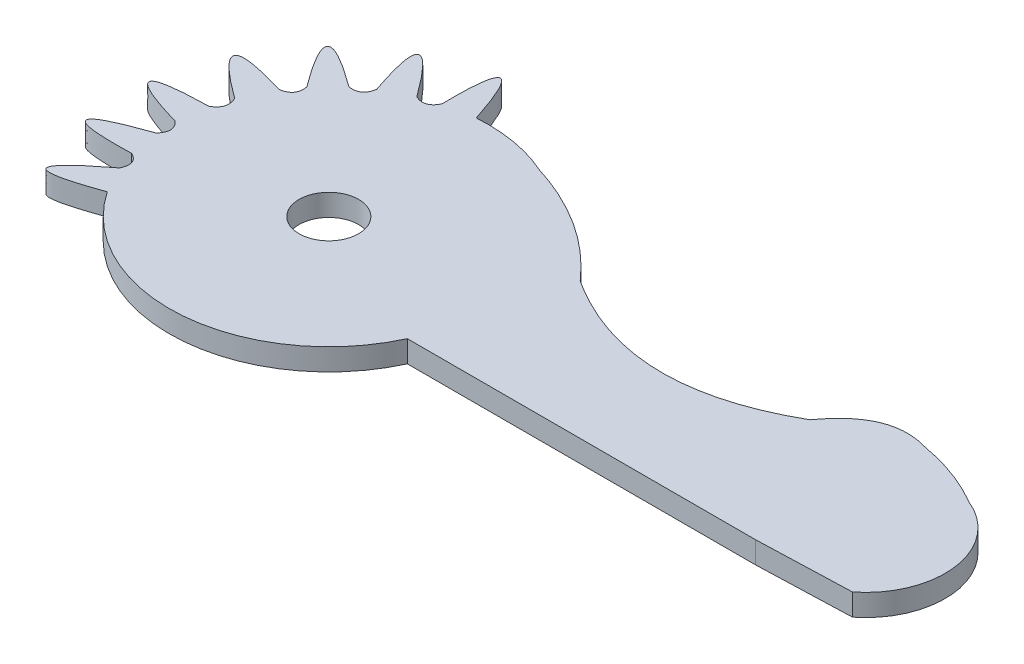
ISO-10303-21;
HEADER;
FILE_DESCRIPTION(('STEP AP214'),'2;1');
FILE_NAME('part.step','',(''),(''),'','','');
FILE_SCHEMA(('AUTOMOTIVE_DESIGN { 1 0 10303 214 1 1 1 1 }'));
ENDSEC;
DATA;
#1=APPLICATION_CONTEXT('core data for automotive mechanical design processes');
#2=APPLICATION_PROTOCOL_DEFINITION('international standard','automotive_design',2000,#1);
#3=PRODUCT_CONTEXT('',#1,'mechanical');
#4=PRODUCT('Part','Part','',(#3));
#5=PRODUCT_RELATED_PRODUCT_CATEGORY('part','',(#4));
#6=PRODUCT_DEFINITION_FORMATION('','',#4);
#7=PRODUCT_DEFINITION_CONTEXT('part definition',#1,'design');
#8=PRODUCT_DEFINITION('design','',#6,#7);
#9=PRODUCT_DEFINITION_SHAPE('','',#8);
#10=(LENGTH_UNIT() NAMED_UNIT(*) SI_UNIT(.MILLI.,.METRE.));
#11=(NAMED_UNIT(*) PLANE_ANGLE_UNIT() SI_UNIT($,.RADIAN.));
#12=(NAMED_UNIT(*) SI_UNIT($,.STERADIAN.) SOLID_ANGLE_UNIT());
#13=UNCERTAINTY_MEASURE_WITH_UNIT(LENGTH_MEASURE(1.E-05),#10,'distance_accuracy_value','');
#14=(GEOMETRIC_REPRESENTATION_CONTEXT(3) GLOBAL_UNCERTAINTY_ASSIGNED_CONTEXT((#13)) GLOBAL_UNIT_ASSIGNED_CONTEXT((#10,
#11,#12)) REPRESENTATION_CONTEXT('',''));
#15=CARTESIAN_POINT('',(0.,0.,0.));
#16=DIRECTION('',(0.,0.,1.));
#17=DIRECTION('',(1.,0.,0.));
#18=AXIS2_PLACEMENT_3D('',#15,#16,#17);
#19=CARTESIAN_POINT('',(0.,2.2,0.));
#20=DIRECTION('',(0.,1.,0.));
#21=DIRECTION('',(0.,0.,1.));
#22=AXIS2_PLACEMENT_3D('',#19,#20,#21);
#23=PLANE('',#22);
#24=CARTESIAN_POINT('',(0.,2.2,0.));
#25=DIRECTION('',(0.,1.,0.));
#26=DIRECTION('',(0.,0.,1.));
#27=AXIS2_PLACEMENT_3D('',#24,#25,#26);
#28=CIRCLE('',#27,16.0739677070553);
#29=CARTESIAN_POINT('',(-13.3181244117727,2.2,9.));
#30=VERTEX_POINT('',#29);
#31=CARTESIAN_POINT('',(14.6110382193551,2.2,6.7));
#32=VERTEX_POINT('',#31);
#33=EDGE_CURVE('E397',#30,#32,#28,.T.);
#34=ORIENTED_EDGE('',*,*,#33,.T.);
#35=DIRECTION('',(1.,0.,0.));
#36=VECTOR('',#35,1.);
#37=CARTESIAN_POINT('',(14.6110382193551,2.2,6.7));
#38=LINE('',#37,#36);
#39=CARTESIAN_POINT('',(49.6904432139309,2.2,6.7));
#40=VERTEX_POINT('',#39);
#41=EDGE_CURVE('E139',#32,#40,#38,.T.);
#42=ORIENTED_EDGE('',*,*,#41,.T.);
#43=DIRECTION('',(0.999414604685837,0.,-0.0342118099587287));
#44=VECTOR('',#43,1.);
#45=CARTESIAN_POINT('',(49.6904432139309,2.2,6.7));
#46=LINE('',#45,#44);
#47=CARTESIAN_POINT('',(59.1421347100975,2.2,6.37645112274797));
#48=VERTEX_POINT('',#47);
#49=EDGE_CURVE('E394',#40,#48,#46,.T.);
#50=ORIENTED_EDGE('',*,*,#49,.T.);
#51=CARTESIAN_POINT('',(54.1955227979198,2.2,0.08908040119025));
#52=DIRECTION('',(0.,1.,0.));
#53=DIRECTION('',(0.,0.,1.));
#54=AXIS2_PLACEMENT_3D('',#51,#52,#53);
#55=CIRCLE('',#54,8.);
#56=CARTESIAN_POINT('',(57.1955227979198,2.2,-7.32711808590541));
#57=VERTEX_POINT('',#56);
#58=EDGE_CURVE('E389',#48,#57,#55,.T.);
#59=ORIENTED_EDGE('',*,*,#58,.T.);
#60=CARTESIAN_POINT('',(57.1955227979198,2.2,-7.32711808590541));
#61=CARTESIAN_POINT('',(55.0441661515011,2.2,-8.59284596352752));
#62=CARTESIAN_POINT('',(52.7613610635912,2.2,-9.44385982918825));
#63=CARTESIAN_POINT('',(50.3471075342058,2.2,-9.88015968288478));
#64=B_SPLINE_CURVE_WITH_KNOTS('',3,(#60,#61,#62,#63),.UNSPECIFIED.,.F.,.F.,(4,4),
(0.288436631386398,1.),.UNSPECIFIED.);
#65=CARTESIAN_POINT('',(50.3471075342058,2.2,-9.88015968288478));
#66=VERTEX_POINT('',#65);
#67=EDGE_CURVE('E381',#57,#66,#64,.T.);
#68=ORIENTED_EDGE('',*,*,#67,.T.);
#69=CARTESIAN_POINT('',(50.3471075342058,2.2,-9.88015968288478));
#70=CARTESIAN_POINT('',(49.3037046635884,2.2,-10.1960733015901));
#71=CARTESIAN_POINT('',(46.3170816729696,2.2,-10.5567937203678));
#72=CARTESIAN_POINT('',(43.6670457923112,2.2,-8.84896027063307));
#73=CARTESIAN_POINT('',(41.9843605931134,2.2,-6.51415198749853));
#74=B_SPLINE_CURVE_WITH_KNOTS('',3,(#69,#70,#71,#72,#73),.UNSPECIFIED.,.F.,.F.,(4,1,4),
(0.0900850462791173,0.305835094832972,0.736118781976558),.UNSPECIFIED.);
#75=CARTESIAN_POINT('',(41.9843605931134,2.2,-6.51415198749853));
#76=VERTEX_POINT('',#75);
#77=EDGE_CURVE('E377',#66,#76,#74,.T.);
#78=ORIENTED_EDGE('',*,*,#77,.T.);
#79=CARTESIAN_POINT('',(41.9843605931134,2.2,-6.51415198749853));
#80=CARTESIAN_POINT('',(29.823970963395,2.2,0.449921725729593));
#81=CARTESIAN_POINT('',(18.2939540597451,2.2,-7.03712532677834));
#82=B_SPLINE_CURVE_WITH_KNOTS('',2,(#79,#80,#81),.UNSPECIFIED.,.F.,.F.,(3,3),(0.,1.),.UNSPECIFIED.);
#83=CARTESIAN_POINT('',(18.2939540597451,2.2,-7.03712532677834));
#84=VERTEX_POINT('',#83);
#85=EDGE_CURVE('E352',#76,#84,#82,.T.);
#86=ORIENTED_EDGE('',*,*,#85,.T.);
#87=CARTESIAN_POINT('',(18.2939540597451,2.2,-7.03712532677834));
#88=CARTESIAN_POINT('',(13.5089534166022,2.2,-12.4928165220149));
#89=CARTESIAN_POINT('',(6.55512816257974,2.2,-14.6766049418662));
#90=B_SPLINE_CURVE_WITH_KNOTS('',2,(#87,#88,#89),.UNSPECIFIED.,.F.,.F.,(3,3),(0.,1.),.UNSPECIFIED.);
#91=CARTESIAN_POINT('',(6.55512816257974,2.2,-14.6766049418662));
#92=VERTEX_POINT('',#91);
#93=EDGE_CURVE('E347',#84,#92,#90,.T.);
#94=ORIENTED_EDGE('',*,*,#93,.T.);
#95=CARTESIAN_POINT('',(0.,2.2,0.));
#96=DIRECTION('',(0.,1.,0.));
#97=DIRECTION('',(0.,0.,1.));
#98=AXIS2_PLACEMENT_3D('',#95,#96,#97);
#99=CIRCLE('',#98,16.0739677070553);
#100=CARTESIAN_POINT('',(-1.17402328634825,2.2,-16.0310357485275));
#101=VERTEX_POINT('',#100);
#102=EDGE_CURVE('E342',#92,#101,#99,.T.);
#103=ORIENTED_EDGE('',*,*,#102,.T.);
#104=CARTESIAN_POINT('',(-1.17402328634825,2.2,-16.0310357485275));
#105=CARTESIAN_POINT('',(-4.31115929351365,2.2,-25.6439633812806));
#106=CARTESIAN_POINT('',(-4.13250681705568,2.2,-15.533667475984));
#107=B_SPLINE_CURVE_WITH_KNOTS('',2,(#104,#105,#106),.UNSPECIFIED.,.F.,.F.,(3,3),(0.,1.),.UNSPECIFIED.);
#108=CARTESIAN_POINT('',(-4.13250681705568,2.2,-15.533667475984));
#109=VERTEX_POINT('',#108);
#110=EDGE_CURVE('E334',#101,#109,#107,.T.);
#111=ORIENTED_EDGE('',*,*,#110,.T.);
#112=CARTESIAN_POINT('',(-4.13250681705568,2.2,-15.533667475984));
#113=CARTESIAN_POINT('',(-4.764310753869,2.2,-14.2684308240382));
#114=CARTESIAN_POINT('',(-6.02954740581487,2.2,-14.9002347608515));
#115=B_SPLINE_CURVE_WITH_KNOTS('',2,(#112,#113,#114),.UNSPECIFIED.,.F.,.F.,(3,3),(0.,1.),.UNSPECIFIED.);
#116=CARTESIAN_POINT('',(-6.02954740581487,2.2,-14.9002347608515));
#117=VERTEX_POINT('',#116);
#118=EDGE_CURVE('E330',#109,#117,#115,.T.);
#119=ORIENTED_EDGE('',*,*,#118,.T.);
#120=CARTESIAN_POINT('',(-6.02954740581487,2.2,-14.9002347608515));
#121=CARTESIAN_POINT('',(-11.9612421792253,2.2,-23.0895569009981));
#122=CARTESIAN_POINT('',(-8.69333508977325,2.2,-13.5202944814221));
#123=B_SPLINE_CURVE_WITH_KNOTS('',2,(#120,#121,#122),.UNSPECIFIED.,.F.,.F.,(3,3),(0.,1.),.UNSPECIFIED.);
#124=CARTESIAN_POINT('',(-8.69333508977325,2.2,-13.5202944814221));
#125=VERTEX_POINT('',#124);
#126=EDGE_CURVE('E307',#117,#125,#123,.T.);
#127=ORIENTED_EDGE('',*,*,#126,.T.);
#128=CARTESIAN_POINT('',(-8.69333508977325,2.2,-13.5202944814221));
#129=CARTESIAN_POINT('',(-8.90707486155734,2.2,-12.1223262021119));
#130=CARTESIAN_POINT('',(-10.3050431408676,2.2,-12.336065973896));
#131=B_SPLINE_CURVE_WITH_KNOTS('',2,(#128,#129,#130),.UNSPECIFIED.,.F.,.F.,(3,3),(0.,1.),.UNSPECIFIED.);
#132=CARTESIAN_POINT('',(-10.3050431408676,2.2,-12.336065973896));
#133=VERTEX_POINT('',#132);
#134=EDGE_CURVE('E299',#125,#133,#131,.T.);
#135=ORIENTED_EDGE('',*,*,#134,.T.);
#136=CARTESIAN_POINT('',(-10.3050431408676,2.2,-12.336065973896));
#137=CARTESIAN_POINT('',(-18.4606814909088,2.2,-18.3139889495905));
#138=CARTESIAN_POINT('',(-12.4178848215133,2.2,-10.2063007209804));
#139=B_SPLINE_CURVE_WITH_KNOTS('',2,(#136,#137,#138),.UNSPECIFIED.,.F.,.F.,(3,3),(0.,1.),.UNSPECIFIED.);
#140=CARTESIAN_POINT('',(-12.4178848215133,2.2,-10.2063007209804));
#141=VERTEX_POINT('',#140);
#142=EDGE_CURVE('E291',#133,#141,#139,.T.);
#143=ORIENTED_EDGE('',*,*,#142,.T.);
#144=CARTESIAN_POINT('',(-12.4178848215133,2.2,-10.2063007209804));
#145=CARTESIAN_POINT('',(-12.1929991611997,2.2,-8.81008209920758));
#146=CARTESIAN_POINT('',(-13.5892177829726,2.2,-8.58519643889399));
#147=B_SPLINE_CURVE_WITH_KNOTS('',2,(#144,#145,#146),.UNSPECIFIED.,.F.,.F.,(3,3),(0.,1.),.UNSPECIFIED.);
#148=CARTESIAN_POINT('',(-13.5892177829726,2.2,-8.58519643889399));
#149=VERTEX_POINT('',#148);
#150=EDGE_CURVE('E287',#141,#149,#147,.T.);
#151=ORIENTED_EDGE('',*,*,#150,.T.);
#152=CARTESIAN_POINT('',(-13.5892177829726,2.2,-8.58519643889399));
#153=CARTESIAN_POINT('',(-23.2950739914482,2.2,-11.5171465993588));
#154=CARTESIAN_POINT('',(-15.0724257698096,2.2,-5.58519643889399));
#155=B_SPLINE_CURVE_WITH_KNOTS('',2,(#152,#153,#154),.UNSPECIFIED.,.F.,.F.,(3,3),(0.,1.),.UNSPECIFIED.);
#156=CARTESIAN_POINT('',(-15.0724257698096,2.2,-5.58519643889399));
#157=VERTEX_POINT('',#156);
#158=EDGE_CURVE('E264',#149,#157,#155,.T.);
#159=ORIENTED_EDGE('',*,*,#158,.T.);
#160=CARTESIAN_POINT('',(-15.0724257698096,2.2,-5.58519643889399));
#161=CARTESIAN_POINT('',(-14.4124610618603,2.2,-4.2993373399729));
#162=CARTESIAN_POINT('',(-15.6690396751683,2.2,-3.58519643889399));
#163=B_SPLINE_CURVE_WITH_KNOTS('',2,(#160,#161,#162),.UNSPECIFIED.,.F.,.F.,(3,3),(0.,1.),.UNSPECIFIED.);
#164=CARTESIAN_POINT('',(-15.6690396751683,2.2,-3.58519643889399));
#165=VERTEX_POINT('',#164);
#166=EDGE_CURVE('E256',#157,#165,#163,.T.);
#167=ORIENTED_EDGE('',*,*,#166,.T.);
#168=CARTESIAN_POINT('',(-15.6690396751683,2.2,-3.58519643889399));
#169=CARTESIAN_POINT('',(-25.7809172176548,2.2,-3.38823153237769));
#170=CARTESIAN_POINT('',(-16.06331170635,2.2,-0.585196438893989));
#171=B_SPLINE_CURVE_WITH_KNOTS('',2,(#168,#169,#170),.UNSPECIFIED.,.F.,.F.,(3,3),(0.,1.),.UNSPECIFIED.);
#172=CARTESIAN_POINT('',(-16.06331170635,2.2,-0.585196438893989));
#173=VERTEX_POINT('',#172);
#174=EDGE_CURVE('E248',#165,#173,#171,.T.);
#175=ORIENTED_EDGE('',*,*,#174,.T.);
#176=CARTESIAN_POINT('',(-16.06331170635,2.2,-0.585196438893989));
#177=CARTESIAN_POINT('',(-15.0378750753459,2.2,0.394118454941576));
#178=CARTESIAN_POINT('',(-16.0115823306423,2.2,1.41480356110601));
#179=B_SPLINE_CURVE_WITH_KNOTS('',2,(#176,#177,#178),.UNSPECIFIED.,.F.,.F.,(3,3),(0.,1.),.UNSPECIFIED.);
#180=CARTESIAN_POINT('',(-16.0115823306423,2.2,1.41480356110601));
#181=VERTEX_POINT('',#180);
#182=EDGE_CURVE('E200',#173,#181,#179,.T.);
#183=ORIENTED_EDGE('',*,*,#182,.T.);
#184=CARTESIAN_POINT('',(-16.0115823306423,2.2,1.41480356110601));
#185=CARTESIAN_POINT('',(-25.566384922753,2.2,4.7363949242953));
#186=CARTESIAN_POINT('',(-15.4558062670409,2.2,4.41480356110602));
#187=B_SPLINE_CURVE_WITH_KNOTS('',2,(#184,#185,#186),.UNSPECIFIED.,.F.,.F.,(3,3),(0.,1.),.UNSPECIFIED.);
#188=CARTESIAN_POINT('',(-15.4558062670409,2.2,4.41480356110602));
#189=VERTEX_POINT('',#188);
#190=EDGE_CURVE('E194',#181,#189,#187,.T.);
#191=ORIENTED_EDGE('',*,*,#190,.T.);
#192=CARTESIAN_POINT('',(-15.4558062670409,2.2,4.41480356110602));
#193=CARTESIAN_POINT('',(-14.1792697764444,2.2,5.02345336861065));
#194=CARTESIAN_POINT('',(-14.787919583949,2.2,6.2999898592072));
#195=B_SPLINE_CURVE_WITH_KNOTS('',2,(#192,#193,#194),.UNSPECIFIED.,.F.,.F.,(3,3),(0.,1.),.UNSPECIFIED.);
#196=CARTESIAN_POINT('',(-14.787919583949,2.2,6.2999898592072));
#197=VERTEX_POINT('',#196);
#198=EDGE_CURVE('E198',#189,#197,#195,.T.);
#199=ORIENTED_EDGE('',*,*,#198,.T.);
#200=CARTESIAN_POINT('',(-14.787919583949,2.2,6.2999898592072));
#201=CARTESIAN_POINT('',(-22.8359917841327,2.2,12.4311497831339));
#202=CARTESIAN_POINT('',(-13.3181244117727,2.2,9.));
#203=B_SPLINE_CURVE_WITH_KNOTS('',2,(#200,#201,#202),.UNSPECIFIED.,.F.,.F.,(3,3),(0.,1.),.UNSPECIFIED.);
#204=EDGE_CURVE('E54',#197,#30,#203,.T.);
#205=ORIENTED_EDGE('',*,*,#204,.T.);
#206=EDGE_LOOP('',(#34,#42,#50,#59,#68,#78,#86,#94,#103,#111,#119,#127,#135,#143,#151,#159,#167,
#175,#183,#191,#199,#205));
#207=FACE_BOUND('',#206,.T.);
#208=CARTESIAN_POINT('',(0.,2.2,0.));
#209=DIRECTION('',(0.,1.,0.));
#210=DIRECTION('',(0.,0.,1.));
#211=AXIS2_PLACEMENT_3D('',#208,#209,#210);
#212=CIRCLE('',#211,3.);
#213=CARTESIAN_POINT('',(0.,2.2,3.));
#214=VERTEX_POINT('',#213);
#215=EDGE_CURVE('E402',#214,#214,#212,.T.);
#216=ORIENTED_EDGE('',*,*,#215,.F.);
#217=EDGE_LOOP('',(#216));
#218=FACE_BOUND('',#217,.T.);
#219=ADVANCED_FACE('F37',(#207,#218),#23,.T.);
#220=CARTESIAN_POINT('',(0.,0.,0.));
#221=DIRECTION('',(0.,1.,0.));
#222=DIRECTION('',(0.,0.,1.));
#223=AXIS2_PLACEMENT_3D('',#220,#221,#222);
#224=PLANE('',#223);
#225=CARTESIAN_POINT('',(0.,0.,0.));
#226=DIRECTION('',(0.,1.,0.));
#227=DIRECTION('',(0.,0.,1.));
#228=AXIS2_PLACEMENT_3D('',#225,#226,#227);
#229=CIRCLE('',#228,16.0739677070553);
#230=CARTESIAN_POINT('',(-13.3181244117727,0.,9.));
#231=VERTEX_POINT('',#230);
#232=CARTESIAN_POINT('',(14.6110382193551,0.,6.7));
#233=VERTEX_POINT('',#232);
#234=EDGE_CURVE('E404',#231,#233,#229,.T.);
#235=ORIENTED_EDGE('',*,*,#234,.F.);
#236=CARTESIAN_POINT('',(-14.787919583949,0.,6.2999898592072));
#237=CARTESIAN_POINT('',(-22.8359917841327,0.,12.4311497831339));
#238=CARTESIAN_POINT('',(-13.3181244117727,0.,9.));
#239=B_SPLINE_CURVE_WITH_KNOTS('',2,(#236,#237,#238),.UNSPECIFIED.,.F.,.F.,(3,3),(0.,1.),.UNSPECIFIED.);
#240=CARTESIAN_POINT('',(-14.787919583949,0.,6.2999898592072));
#241=VERTEX_POINT('',#240);
#242=EDGE_CURVE('E131',#241,#231,#239,.T.);
#243=ORIENTED_EDGE('',*,*,#242,.F.);
#244=CARTESIAN_POINT('',(-15.4558062670409,0.,4.41480356110602));
#245=CARTESIAN_POINT('',(-14.1792697764444,0.,5.02345336861065));
#246=CARTESIAN_POINT('',(-14.787919583949,0.,6.2999898592072));
#247=B_SPLINE_CURVE_WITH_KNOTS('',2,(#244,#245,#246),.UNSPECIFIED.,.F.,.F.,(3,3),(0.,1.),.UNSPECIFIED.);
#248=CARTESIAN_POINT('',(-15.4558062670409,0.,4.41480356110602));
#249=VERTEX_POINT('',#248);
#250=EDGE_CURVE('E125',#249,#241,#247,.T.);
#251=ORIENTED_EDGE('',*,*,#250,.F.);
#252=CARTESIAN_POINT('',(-16.0115823306423,0.,1.41480356110601));
#253=CARTESIAN_POINT('',(-25.566384922753,0.,4.7363949242953));
#254=CARTESIAN_POINT('',(-15.4558062670409,0.,4.41480356110602));
#255=B_SPLINE_CURVE_WITH_KNOTS('',2,(#252,#253,#254),.UNSPECIFIED.,.F.,.F.,(3,3),(0.,1.),.UNSPECIFIED.);
#256=CARTESIAN_POINT('',(-16.0115823306423,0.,1.41480356110601));
#257=VERTEX_POINT('',#256);
#258=EDGE_CURVE('E208',#257,#249,#255,.T.);
#259=ORIENTED_EDGE('',*,*,#258,.F.);
#260=CARTESIAN_POINT('',(-16.06331170635,0.,-0.585196438893989));
#261=CARTESIAN_POINT('',(-15.0378750753459,0.,0.394118454941576));
#262=CARTESIAN_POINT('',(-16.0115823306423,0.,1.41480356110601));
#263=B_SPLINE_CURVE_WITH_KNOTS('',2,(#260,#261,#262),.UNSPECIFIED.,.F.,.F.,(3,3),(0.,1.),.UNSPECIFIED.);
#264=CARTESIAN_POINT('',(-16.06331170635,0.,-0.585196438893989));
#265=VERTEX_POINT('',#264);
#266=EDGE_CURVE('E508',#265,#257,#263,.T.);
#267=ORIENTED_EDGE('',*,*,#266,.F.);
#268=CARTESIAN_POINT('',(-15.6690396751683,0.,-3.58519643889399));
#269=CARTESIAN_POINT('',(-25.7809172176548,0.,-3.38823153237769));
#270=CARTESIAN_POINT('',(-16.06331170635,0.,-0.585196438893989));
#271=B_SPLINE_CURVE_WITH_KNOTS('',2,(#268,#269,#270),.UNSPECIFIED.,.F.,.F.,(3,3),(0.,1.),.UNSPECIFIED.);
#272=CARTESIAN_POINT('',(-15.6690396751683,0.,-3.58519643889399));
#273=VERTEX_POINT('',#272);
#274=EDGE_CURVE('E501',#273,#265,#271,.T.);
#275=ORIENTED_EDGE('',*,*,#274,.F.);
#276=CARTESIAN_POINT('',(-15.0724257698096,0.,-5.58519643889399));
#277=CARTESIAN_POINT('',(-14.4124610618603,0.,-4.2993373399729));
#278=CARTESIAN_POINT('',(-15.6690396751683,0.,-3.58519643889399));
#279=B_SPLINE_CURVE_WITH_KNOTS('',2,(#276,#277,#278),.UNSPECIFIED.,.F.,.F.,(3,3),(0.,1.),.UNSPECIFIED.);
#280=CARTESIAN_POINT('',(-15.0724257698096,0.,-5.58519643889399));
#281=VERTEX_POINT('',#280);
#282=EDGE_CURVE('E494',#281,#273,#279,.T.);
#283=ORIENTED_EDGE('',*,*,#282,.F.);
#284=CARTESIAN_POINT('',(-13.5892177829726,0.,-8.58519643889399));
#285=CARTESIAN_POINT('',(-23.2950739914482,0.,-11.5171465993588));
#286=CARTESIAN_POINT('',(-15.0724257698096,0.,-5.58519643889399));
#287=B_SPLINE_CURVE_WITH_KNOTS('',2,(#284,#285,#286),.UNSPECIFIED.,.F.,.F.,(3,3),(0.,1.),.UNSPECIFIED.);
#288=CARTESIAN_POINT('',(-13.5892177829726,0.,-8.58519643889399));
#289=VERTEX_POINT('',#288);
#290=EDGE_CURVE('E487',#289,#281,#287,.T.);
#291=ORIENTED_EDGE('',*,*,#290,.F.);
#292=CARTESIAN_POINT('',(-12.4178848215133,0.,-10.2063007209804));
#293=CARTESIAN_POINT('',(-12.1929991611997,0.,-8.81008209920758));
#294=CARTESIAN_POINT('',(-13.5892177829726,0.,-8.58519643889399));
#295=B_SPLINE_CURVE_WITH_KNOTS('',2,(#292,#293,#294),.UNSPECIFIED.,.F.,.F.,(3,3),(0.,1.),.UNSPECIFIED.);
#296=CARTESIAN_POINT('',(-12.4178848215133,0.,-10.2063007209804));
#297=VERTEX_POINT('',#296);
#298=EDGE_CURVE('E480',#297,#289,#295,.T.);
#299=ORIENTED_EDGE('',*,*,#298,.F.);
#300=CARTESIAN_POINT('',(-10.3050431408676,0.,-12.336065973896));
#301=CARTESIAN_POINT('',(-18.4606814909088,0.,-18.3139889495905));
#302=CARTESIAN_POINT('',(-12.4178848215133,0.,-10.2063007209804));
#303=B_SPLINE_CURVE_WITH_KNOTS('',2,(#300,#301,#302),.UNSPECIFIED.,.F.,.F.,(3,3),(0.,1.),.UNSPECIFIED.);
#304=CARTESIAN_POINT('',(-10.3050431408676,0.,-12.336065973896));
#305=VERTEX_POINT('',#304);
#306=EDGE_CURVE('E473',#305,#297,#303,.T.);
#307=ORIENTED_EDGE('',*,*,#306,.F.);
#308=CARTESIAN_POINT('',(-8.69333508977325,0.,-13.5202944814221));
#309=CARTESIAN_POINT('',(-8.90707486155734,0.,-12.1223262021119));
#310=CARTESIAN_POINT('',(-10.3050431408676,0.,-12.336065973896));
#311=B_SPLINE_CURVE_WITH_KNOTS('',2,(#308,#309,#310),.UNSPECIFIED.,.F.,.F.,(3,3),(0.,1.),.UNSPECIFIED.);
#312=CARTESIAN_POINT('',(-8.69333508977325,0.,-13.5202944814221));
#313=VERTEX_POINT('',#312);
#314=EDGE_CURVE('E466',#313,#305,#311,.T.);
#315=ORIENTED_EDGE('',*,*,#314,.F.);
#316=CARTESIAN_POINT('',(-6.02954740581487,0.,-14.9002347608515));
#317=CARTESIAN_POINT('',(-11.9612421792253,0.,-23.0895569009981));
#318=CARTESIAN_POINT('',(-8.69333508977325,0.,-13.5202944814221));
#319=B_SPLINE_CURVE_WITH_KNOTS('',2,(#316,#317,#318),.UNSPECIFIED.,.F.,.F.,(3,3),(0.,1.),.UNSPECIFIED.);
#320=CARTESIAN_POINT('',(-6.02954740581487,0.,-14.9002347608515));
#321=VERTEX_POINT('',#320);
#322=EDGE_CURVE('E459',#321,#313,#319,.T.);
#323=ORIENTED_EDGE('',*,*,#322,.F.);
#324=CARTESIAN_POINT('',(-4.13250681705568,0.,-15.533667475984));
#325=CARTESIAN_POINT('',(-4.764310753869,0.,-14.2684308240382));
#326=CARTESIAN_POINT('',(-6.02954740581487,0.,-14.9002347608515));
#327=B_SPLINE_CURVE_WITH_KNOTS('',2,(#324,#325,#326),.UNSPECIFIED.,.F.,.F.,(3,3),(0.,1.),.UNSPECIFIED.);
#328=CARTESIAN_POINT('',(-4.13250681705568,0.,-15.533667475984));
#329=VERTEX_POINT('',#328);
#330=EDGE_CURVE('E452',#329,#321,#327,.T.);
#331=ORIENTED_EDGE('',*,*,#330,.F.);
#332=CARTESIAN_POINT('',(-1.17402328634825,0.,-16.0310357485275));
#333=CARTESIAN_POINT('',(-4.31115929351365,0.,-25.6439633812806));
#334=CARTESIAN_POINT('',(-4.13250681705568,0.,-15.533667475984));
#335=B_SPLINE_CURVE_WITH_KNOTS('',2,(#332,#333,#334),.UNSPECIFIED.,.F.,.F.,(3,3),(0.,1.),.UNSPECIFIED.);
#336=CARTESIAN_POINT('',(-1.17402328634825,0.,-16.0310357485275));
#337=VERTEX_POINT('',#336);
#338=EDGE_CURVE('E448',#337,#329,#335,.T.);
#339=ORIENTED_EDGE('',*,*,#338,.F.);
#340=CARTESIAN_POINT('',(0.,0.,0.));
#341=DIRECTION('',(0.,1.,0.));
#342=DIRECTION('',(0.,0.,1.));
#343=AXIS2_PLACEMENT_3D('',#340,#341,#342);
#344=CIRCLE('',#343,16.0739677070553);
#345=CARTESIAN_POINT('',(6.55512816257974,0.,-14.6766049418662));
#346=VERTEX_POINT('',#345);
#347=EDGE_CURVE('E443',#346,#337,#344,.T.);
#348=ORIENTED_EDGE('',*,*,#347,.F.);
#349=CARTESIAN_POINT('',(18.2939540597451,0.,-7.03712532677834));
#350=CARTESIAN_POINT('',(13.5089534166022,0.,-12.4928165220149));
#351=CARTESIAN_POINT('',(6.55512816257974,0.,-14.6766049418662));
#352=B_SPLINE_CURVE_WITH_KNOTS('',2,(#349,#350,#351),.UNSPECIFIED.,.F.,.F.,(3,3),(0.,1.),.UNSPECIFIED.);
#353=CARTESIAN_POINT('',(18.2939540597451,0.,-7.03712532677834));
#354=VERTEX_POINT('',#353);
#355=EDGE_CURVE('E436',#354,#346,#352,.T.);
#356=ORIENTED_EDGE('',*,*,#355,.F.);
#357=CARTESIAN_POINT('',(41.9843605931134,0.,-6.51415198749853));
#358=CARTESIAN_POINT('',(29.823970963395,0.,0.449921725729593));
#359=CARTESIAN_POINT('',(18.2939540597451,0.,-7.03712532677834));
#360=B_SPLINE_CURVE_WITH_KNOTS('',2,(#357,#358,#359),.UNSPECIFIED.,.F.,.F.,(3,3),(0.,1.),.UNSPECIFIED.);
#361=CARTESIAN_POINT('',(41.9843605931134,0.,-6.51415198749853));
#362=VERTEX_POINT('',#361);
#363=EDGE_CURVE('E429',#362,#354,#360,.T.);
#364=ORIENTED_EDGE('',*,*,#363,.F.);
#365=CARTESIAN_POINT('',(50.3471075342058,0.,-9.88015968288478));
#366=CARTESIAN_POINT('',(49.3037046635884,0.,-10.1960733015901));
#367=CARTESIAN_POINT('',(46.3170816729696,0.,-10.5567937203678));
#368=CARTESIAN_POINT('',(43.6670457923112,0.,-8.84896027063307));
#369=CARTESIAN_POINT('',(41.9843605931134,0.,-6.51415198749853));
#370=B_SPLINE_CURVE_WITH_KNOTS('',3,(#365,#366,#367,#368,#369),.UNSPECIFIED.,.F.,.F.,(4,1,4),
(0.0900850462791173,0.305835094832972,0.736118781976558),.UNSPECIFIED.);
#371=CARTESIAN_POINT('',(50.3471075342058,0.,-9.88015968288478));
#372=VERTEX_POINT('',#371);
#373=EDGE_CURVE('E422',#372,#362,#370,.T.);
#374=ORIENTED_EDGE('',*,*,#373,.F.);
#375=CARTESIAN_POINT('',(57.1955227979198,0.,-7.32711808590541));
#376=CARTESIAN_POINT('',(55.0441661515011,0.,-8.59284596352752));
#377=CARTESIAN_POINT('',(52.7613610635912,0.,-9.44385982918825));
#378=CARTESIAN_POINT('',(50.3471075342058,0.,-9.88015968288478));
#379=B_SPLINE_CURVE_WITH_KNOTS('',3,(#375,#376,#377,#378),.UNSPECIFIED.,.F.,.F.,(4,4),
(0.288436631386398,1.),.UNSPECIFIED.);
#380=CARTESIAN_POINT('',(57.1955227979198,0.,-7.32711808590541));
#381=VERTEX_POINT('',#380);
#382=EDGE_CURVE('E418',#381,#372,#379,.T.);
#383=ORIENTED_EDGE('',*,*,#382,.F.);
#384=CARTESIAN_POINT('',(54.1955227979198,0.,0.08908040119025));
#385=DIRECTION('',(0.,1.,0.));
#386=DIRECTION('',(0.,0.,1.));
#387=AXIS2_PLACEMENT_3D('',#384,#385,#386);
#388=CIRCLE('',#387,8.);
#389=CARTESIAN_POINT('',(59.1421347100975,0.,6.37645112274797));
#390=VERTEX_POINT('',#389);
#391=EDGE_CURVE('E416',#390,#381,#388,.T.);
#392=ORIENTED_EDGE('',*,*,#391,.F.);
#393=DIRECTION('',(0.999414604685837,0.,-0.0342118099587287));
#394=VECTOR('',#393,1.);
#395=CARTESIAN_POINT('',(49.6904432139309,0.,6.7));
#396=LINE('',#395,#394);
#397=CARTESIAN_POINT('',(49.6904432139309,0.,6.7));
#398=VERTEX_POINT('',#397);
#399=EDGE_CURVE('E412',#398,#390,#396,.T.);
#400=ORIENTED_EDGE('',*,*,#399,.F.);
#401=DIRECTION('',(1.,0.,0.));
#402=VECTOR('',#401,1.);
#403=CARTESIAN_POINT('',(14.6110382193551,0.,6.7));
#404=LINE('',#403,#402);
#405=EDGE_CURVE('E408',#233,#398,#404,.T.);
#406=ORIENTED_EDGE('',*,*,#405,.F.);
#407=EDGE_LOOP('',(#235,#243,#251,#259,#267,#275,#283,#291,#299,#307,#315,#323,#331,#339,#348,
#356,#364,#374,#383,#392,#400,#406));
#408=FACE_BOUND('',#407,.T.);
#409=CARTESIAN_POINT('',(0.,0.,0.));
#410=DIRECTION('',(0.,1.,0.));
#411=DIRECTION('',(0.,0.,1.));
#412=AXIS2_PLACEMENT_3D('',#409,#410,#411);
#413=CIRCLE('',#412,3.);
#414=CARTESIAN_POINT('',(0.,0.,3.));
#415=VERTEX_POINT('',#414);
#416=EDGE_CURVE('E399',#415,#415,#413,.T.);
#417=ORIENTED_EDGE('',*,*,#416,.T.);
#418=EDGE_LOOP('',(#417));
#419=FACE_BOUND('',#418,.T.);
#420=ADVANCED_FACE('F594',(#408,#419),#224,.F.);
#421=CARTESIAN_POINT('',(0.,2.2,0.));
#422=DIRECTION('',(0.,-1.,0.));
#423=DIRECTION('',(0.,0.,-1.));
#424=AXIS2_PLACEMENT_3D('',#421,#422,#423);
#425=CYLINDRICAL_SURFACE('',#424,16.0739677070553);
#426=ORIENTED_EDGE('',*,*,#234,.T.);
#427=DIRECTION('',(0.,-1.,0.));
#428=VECTOR('',#427,1.);
#429=CARTESIAN_POINT('',(14.6110382193551,2.2,6.7));
#430=LINE('',#429,#428);
#431=EDGE_CURVE('E11',#32,#233,#430,.T.);
#432=ORIENTED_EDGE('',*,*,#431,.F.);
#433=ORIENTED_EDGE('',*,*,#33,.F.);
#434=DIRECTION('',(0.,-1.,0.));
#435=VECTOR('',#434,1.);
#436=CARTESIAN_POINT('',(-13.3181244117727,2.2,9.));
#437=LINE('',#436,#435);
#438=EDGE_CURVE('E214',#30,#231,#437,.T.);
#439=ORIENTED_EDGE('',*,*,#438,.T.);
#440=EDGE_LOOP('',(#426,#432,#433,#439));
#441=FACE_BOUND('',#440,.T.);
#442=ADVANCED_FACE('F39',(#441),#425,.T.);
#443=CARTESIAN_POINT('',(14.6110382193551,2.2,6.7));
#444=DIRECTION('',(0.,0.,-1.));
#445=DIRECTION('',(-1.,0.,0.));
#446=AXIS2_PLACEMENT_3D('',#443,#444,#445);
#447=PLANE('',#446);
#448=ORIENTED_EDGE('',*,*,#405,.T.);
#449=DIRECTION('',(0.,-1.,0.));
#450=VECTOR('',#449,1.);
#451=CARTESIAN_POINT('',(49.6904432139309,2.2,6.7));
#452=LINE('',#451,#450);
#453=EDGE_CURVE('E46',#40,#398,#452,.T.);
#454=ORIENTED_EDGE('',*,*,#453,.F.);
#455=ORIENTED_EDGE('',*,*,#41,.F.);
#456=ORIENTED_EDGE('',*,*,#431,.T.);
#457=EDGE_LOOP('',(#448,#454,#455,#456));
#458=FACE_BOUND('',#457,.T.);
#459=ADVANCED_FACE('F608',(#458),#447,.F.);
#460=CARTESIAN_POINT('',(49.6904432139309,2.2,6.7));
#461=DIRECTION('',(-0.0342118099587287,0.,-0.999414604685837));
#462=DIRECTION('',(-0.999414604685837,0.,0.0342118099587287));
#463=AXIS2_PLACEMENT_3D('',#460,#461,#462);
#464=PLANE('',#463);
#465=ORIENTED_EDGE('',*,*,#399,.T.);
#466=DIRECTION('',(0.,-1.,0.));
#467=VECTOR('',#466,1.);
#468=CARTESIAN_POINT('',(59.1421347100975,2.2,6.37645112274797));
#469=LINE('',#468,#467);
#470=EDGE_CURVE('E584',#48,#390,#469,.T.);
#471=ORIENTED_EDGE('',*,*,#470,.F.);
#472=ORIENTED_EDGE('',*,*,#49,.F.);
#473=ORIENTED_EDGE('',*,*,#453,.T.);
#474=EDGE_LOOP('',(#465,#471,#472,#473));
#475=FACE_BOUND('',#474,.T.);
#476=ADVANCED_FACE('F590',(#475),#464,.F.);
#477=CARTESIAN_POINT('',(54.1955227979198,2.2,0.08908040119025));
#478=DIRECTION('',(0.,-1.,0.));
#479=DIRECTION('',(0.,0.,-1.));
#480=AXIS2_PLACEMENT_3D('',#477,#478,#479);
#481=CYLINDRICAL_SURFACE('',#480,8.);
#482=ORIENTED_EDGE('',*,*,#391,.T.);
#483=DIRECTION('',(0.,-1.,0.));
#484=VECTOR('',#483,1.);
#485=CARTESIAN_POINT('',(57.1955227979198,2.2,-7.32711808590541));
#486=LINE('',#485,#484);
#487=EDGE_CURVE('E581',#57,#381,#486,.T.);
#488=ORIENTED_EDGE('',*,*,#487,.F.);
#489=ORIENTED_EDGE('',*,*,#58,.F.);
#490=ORIENTED_EDGE('',*,*,#470,.T.);
#491=EDGE_LOOP('',(#482,#488,#489,#490));
#492=FACE_BOUND('',#491,.T.);
#493=ADVANCED_FACE('F600',(#492),#481,.T.);
#494=DIRECTION('',(0.,-1.,0.));
#495=VECTOR('',#494,1.);
#496=SURFACE_OF_LINEAR_EXTRUSION('',#64,#495);
#497=ORIENTED_EDGE('',*,*,#382,.T.);
#498=DIRECTION('',(0.,-1.,0.));
#499=VECTOR('',#498,1.);
#500=CARTESIAN_POINT('',(50.3471075342058,2.2,-9.88015968288478));
#501=LINE('',#500,#499);
#502=EDGE_CURVE('E578',#66,#372,#501,.T.);
#503=ORIENTED_EDGE('',*,*,#502,.F.);
#504=ORIENTED_EDGE('',*,*,#67,.F.);
#505=ORIENTED_EDGE('',*,*,#487,.T.);
#506=EDGE_LOOP('',(#497,#503,#504,#505));
#507=FACE_BOUND('',#506,.T.);
#508=ADVANCED_FACE('F373',(#507),#496,.F.);
#509=DIRECTION('',(0.,-1.,0.));
#510=VECTOR('',#509,1.);
#511=SURFACE_OF_LINEAR_EXTRUSION('',#74,#510);
#512=ORIENTED_EDGE('',*,*,#373,.T.);
#513=DIRECTION('',(0.,-1.,0.));
#514=VECTOR('',#513,1.);
#515=CARTESIAN_POINT('',(41.9843605931134,2.2,-6.51415198749853));
#516=LINE('',#515,#514);
#517=EDGE_CURVE('E575',#76,#362,#516,.T.);
#518=ORIENTED_EDGE('',*,*,#517,.F.);
#519=ORIENTED_EDGE('',*,*,#77,.F.);
#520=ORIENTED_EDGE('',*,*,#502,.T.);
#521=EDGE_LOOP('',(#512,#518,#519,#520));
#522=FACE_BOUND('',#521,.T.);
#523=ADVANCED_FACE('F369',(#522),#511,.F.);
#524=DIRECTION('',(0.,-1.,0.));
#525=VECTOR('',#524,1.);
#526=SURFACE_OF_LINEAR_EXTRUSION('',#82,#525);
#527=ORIENTED_EDGE('',*,*,#363,.T.);
#528=DIRECTION('',(0.,-1.,0.));
#529=VECTOR('',#528,1.);
#530=CARTESIAN_POINT('',(18.2939540597451,2.2,-7.03712532677834));
#531=LINE('',#530,#529);
#532=EDGE_CURVE('E572',#84,#354,#531,.T.);
#533=ORIENTED_EDGE('',*,*,#532,.F.);
#534=ORIENTED_EDGE('',*,*,#85,.F.);
#535=ORIENTED_EDGE('',*,*,#517,.T.);
#536=EDGE_LOOP('',(#527,#533,#534,#535));
#537=FACE_BOUND('',#536,.T.);
#538=ADVANCED_FACE('F365',(#537),#526,.F.);
#539=DIRECTION('',(0.,-1.,0.));
#540=VECTOR('',#539,1.);
#541=SURFACE_OF_LINEAR_EXTRUSION('',#90,#540);
#542=ORIENTED_EDGE('',*,*,#355,.T.);
#543=DIRECTION('',(0.,-1.,0.));
#544=VECTOR('',#543,1.);
#545=CARTESIAN_POINT('',(6.55512816257974,2.2,-14.6766049418662));
#546=LINE('',#545,#544);
#547=EDGE_CURVE('E569',#92,#346,#546,.T.);
#548=ORIENTED_EDGE('',*,*,#547,.F.);
#549=ORIENTED_EDGE('',*,*,#93,.F.);
#550=ORIENTED_EDGE('',*,*,#532,.T.);
#551=EDGE_LOOP('',(#542,#548,#549,#550));
#552=FACE_BOUND('',#551,.T.);
#553=ADVANCED_FACE('F361',(#552),#541,.F.);
#554=CARTESIAN_POINT('',(0.,2.2,0.));
#555=DIRECTION('',(0.,-1.,0.));
#556=DIRECTION('',(0.,0.,-1.));
#557=AXIS2_PLACEMENT_3D('',#554,#555,#556);
#558=CYLINDRICAL_SURFACE('',#557,16.0739677070553);
#559=ORIENTED_EDGE('',*,*,#347,.T.);
#560=DIRECTION('',(0.,-1.,0.));
#561=VECTOR('',#560,1.);
#562=CARTESIAN_POINT('',(-1.17402328634825,2.2,-16.0310357485275));
#563=LINE('',#562,#561);
#564=EDGE_CURVE('E566',#101,#337,#563,.T.);
#565=ORIENTED_EDGE('',*,*,#564,.F.);
#566=ORIENTED_EDGE('',*,*,#102,.F.);
#567=ORIENTED_EDGE('',*,*,#547,.T.);
#568=EDGE_LOOP('',(#559,#565,#566,#567));
#569=FACE_BOUND('',#568,.T.);
#570=ADVANCED_FACE('F364',(#569),#558,.T.);
#571=DIRECTION('',(0.,-1.,0.));
#572=VECTOR('',#571,1.);
#573=SURFACE_OF_LINEAR_EXTRUSION('',#107,#572);
#574=ORIENTED_EDGE('',*,*,#338,.T.);
#575=DIRECTION('',(0.,-1.,0.));
#576=VECTOR('',#575,1.);
#577=CARTESIAN_POINT('',(-4.13250681705568,2.2,-15.533667475984));
#578=LINE('',#577,#576);
#579=EDGE_CURVE('E563',#109,#329,#578,.T.);
#580=ORIENTED_EDGE('',*,*,#579,.F.);
#581=ORIENTED_EDGE('',*,*,#110,.F.);
#582=ORIENTED_EDGE('',*,*,#564,.T.);
#583=EDGE_LOOP('',(#574,#580,#581,#582));
#584=FACE_BOUND('',#583,.T.);
#585=ADVANCED_FACE('F326',(#584),#573,.F.);
#586=DIRECTION('',(0.,-1.,0.));
#587=VECTOR('',#586,1.);
#588=SURFACE_OF_LINEAR_EXTRUSION('',#115,#587);
#589=ORIENTED_EDGE('',*,*,#330,.T.);
#590=DIRECTION('',(0.,-1.,0.));
#591=VECTOR('',#590,1.);
#592=CARTESIAN_POINT('',(-6.02954740581487,2.2,-14.9002347608515));
#593=LINE('',#592,#591);
#594=EDGE_CURVE('E560',#117,#321,#593,.T.);
#595=ORIENTED_EDGE('',*,*,#594,.F.);
#596=ORIENTED_EDGE('',*,*,#118,.F.);
#597=ORIENTED_EDGE('',*,*,#579,.T.);
#598=EDGE_LOOP('',(#589,#595,#596,#597));
#599=FACE_BOUND('',#598,.T.);
#600=ADVANCED_FACE('F322',(#599),#588,.F.);
#601=DIRECTION('',(0.,-1.,0.));
#602=VECTOR('',#601,1.);
#603=SURFACE_OF_LINEAR_EXTRUSION('',#123,#602);
#604=ORIENTED_EDGE('',*,*,#322,.T.);
#605=DIRECTION('',(0.,-1.,0.));
#606=VECTOR('',#605,1.);
#607=CARTESIAN_POINT('',(-8.69333508977325,2.2,-13.5202944814221));
#608=LINE('',#607,#606);
#609=EDGE_CURVE('E557',#125,#313,#608,.T.);
#610=ORIENTED_EDGE('',*,*,#609,.F.);
#611=ORIENTED_EDGE('',*,*,#126,.F.);
#612=ORIENTED_EDGE('',*,*,#594,.T.);
#613=EDGE_LOOP('',(#604,#610,#611,#612));
#614=FACE_BOUND('',#613,.T.);
#615=ADVANCED_FACE('F318',(#614),#603,.F.);
#616=DIRECTION('',(0.,-1.,0.));
#617=VECTOR('',#616,1.);
#618=SURFACE_OF_LINEAR_EXTRUSION('',#131,#617);
#619=ORIENTED_EDGE('',*,*,#314,.T.);
#620=DIRECTION('',(0.,-1.,0.));
#621=VECTOR('',#620,1.);
#622=CARTESIAN_POINT('',(-10.3050431408676,2.2,-12.336065973896));
#623=LINE('',#622,#621);
#624=EDGE_CURVE('E554',#133,#305,#623,.T.);
#625=ORIENTED_EDGE('',*,*,#624,.F.);
#626=ORIENTED_EDGE('',*,*,#134,.F.);
#627=ORIENTED_EDGE('',*,*,#609,.T.);
#628=EDGE_LOOP('',(#619,#625,#626,#627));
#629=FACE_BOUND('',#628,.T.);
#630=ADVANCED_FACE('F315',(#629),#618,.F.);
#631=DIRECTION('',(0.,-1.,0.));
#632=VECTOR('',#631,1.);
#633=SURFACE_OF_LINEAR_EXTRUSION('',#139,#632);
#634=ORIENTED_EDGE('',*,*,#306,.T.);
#635=DIRECTION('',(0.,-1.,0.));
#636=VECTOR('',#635,1.);
#637=CARTESIAN_POINT('',(-12.4178848215133,2.2,-10.2063007209804));
#638=LINE('',#637,#636);
#639=EDGE_CURVE('E551',#141,#297,#638,.T.);
#640=ORIENTED_EDGE('',*,*,#639,.F.);
#641=ORIENTED_EDGE('',*,*,#142,.F.);
#642=ORIENTED_EDGE('',*,*,#624,.T.);
#643=EDGE_LOOP('',(#634,#640,#641,#642));
#644=FACE_BOUND('',#643,.T.);
#645=ADVANCED_FACE('F283',(#644),#633,.F.);
#646=DIRECTION('',(0.,-1.,0.));
#647=VECTOR('',#646,1.);
#648=SURFACE_OF_LINEAR_EXTRUSION('',#147,#647);
#649=ORIENTED_EDGE('',*,*,#298,.T.);
#650=DIRECTION('',(0.,-1.,0.));
#651=VECTOR('',#650,1.);
#652=CARTESIAN_POINT('',(-13.5892177829726,2.2,-8.58519643889399));
#653=LINE('',#652,#651);
#654=EDGE_CURVE('E548',#149,#289,#653,.T.);
#655=ORIENTED_EDGE('',*,*,#654,.F.);
#656=ORIENTED_EDGE('',*,*,#150,.F.);
#657=ORIENTED_EDGE('',*,*,#639,.T.);
#658=EDGE_LOOP('',(#649,#655,#656,#657));
#659=FACE_BOUND('',#658,.T.);
#660=ADVANCED_FACE('F279',(#659),#648,.F.);
#661=DIRECTION('',(0.,-1.,0.));
#662=VECTOR('',#661,1.);
#663=SURFACE_OF_LINEAR_EXTRUSION('',#155,#662);
#664=ORIENTED_EDGE('',*,*,#290,.T.);
#665=DIRECTION('',(0.,-1.,0.));
#666=VECTOR('',#665,1.);
#667=CARTESIAN_POINT('',(-15.0724257698096,2.2,-5.58519643889399));
#668=LINE('',#667,#666);
#669=EDGE_CURVE('E545',#157,#281,#668,.T.);
#670=ORIENTED_EDGE('',*,*,#669,.F.);
#671=ORIENTED_EDGE('',*,*,#158,.F.);
#672=ORIENTED_EDGE('',*,*,#654,.T.);
#673=EDGE_LOOP('',(#664,#670,#671,#672));
#674=FACE_BOUND('',#673,.T.);
#675=ADVANCED_FACE('F275',(#674),#663,.F.);
#676=DIRECTION('',(0.,-1.,0.));
#677=VECTOR('',#676,1.);
#678=SURFACE_OF_LINEAR_EXTRUSION('',#163,#677);
#679=ORIENTED_EDGE('',*,*,#282,.T.);
#680=DIRECTION('',(0.,-1.,0.));
#681=VECTOR('',#680,1.);
#682=CARTESIAN_POINT('',(-15.6690396751683,2.2,-3.58519643889399));
#683=LINE('',#682,#681);
#684=EDGE_CURVE('E542',#165,#273,#683,.T.);
#685=ORIENTED_EDGE('',*,*,#684,.F.);
#686=ORIENTED_EDGE('',*,*,#166,.F.);
#687=ORIENTED_EDGE('',*,*,#669,.T.);
#688=EDGE_LOOP('',(#679,#685,#686,#687));
#689=FACE_BOUND('',#688,.T.);
#690=ADVANCED_FACE('F272',(#689),#678,.F.);
#691=DIRECTION('',(0.,-1.,0.));
#692=VECTOR('',#691,1.);
#693=SURFACE_OF_LINEAR_EXTRUSION('',#171,#692);
#694=ORIENTED_EDGE('',*,*,#274,.T.);
#695=DIRECTION('',(0.,-1.,0.));
#696=VECTOR('',#695,1.);
#697=CARTESIAN_POINT('',(-16.06331170635,2.2,-0.585196438893989));
#698=LINE('',#697,#696);
#699=EDGE_CURVE('E539',#173,#265,#698,.T.);
#700=ORIENTED_EDGE('',*,*,#699,.F.);
#701=ORIENTED_EDGE('',*,*,#174,.F.);
#702=ORIENTED_EDGE('',*,*,#684,.T.);
#703=EDGE_LOOP('',(#694,#700,#701,#702));
#704=FACE_BOUND('',#703,.T.);
#705=ADVANCED_FACE('F241',(#704),#693,.F.);
#706=DIRECTION('',(0.,-1.,0.));
#707=VECTOR('',#706,1.);
#708=SURFACE_OF_LINEAR_EXTRUSION('',#179,#707);
#709=ORIENTED_EDGE('',*,*,#266,.T.);
#710=DIRECTION('',(0.,-1.,0.));
#711=VECTOR('',#710,1.);
#712=CARTESIAN_POINT('',(-16.0115823306423,2.2,1.41480356110601));
#713=LINE('',#712,#711);
#714=EDGE_CURVE('E209',#181,#257,#713,.T.);
#715=ORIENTED_EDGE('',*,*,#714,.F.);
#716=ORIENTED_EDGE('',*,*,#182,.F.);
#717=ORIENTED_EDGE('',*,*,#699,.T.);
#718=EDGE_LOOP('',(#709,#715,#716,#717));
#719=FACE_BOUND('',#718,.T.);
#720=ADVANCED_FACE('F238',(#719),#708,.F.);
#721=DIRECTION('',(0.,-1.,0.));
#722=VECTOR('',#721,1.);
#723=SURFACE_OF_LINEAR_EXTRUSION('',#187,#722);
#724=ORIENTED_EDGE('',*,*,#258,.T.);
#725=DIRECTION('',(0.,-1.,0.));
#726=VECTOR('',#725,1.);
#727=CARTESIAN_POINT('',(-15.4558062670409,2.2,4.41480356110602));
#728=LINE('',#727,#726);
#729=EDGE_CURVE('E205',#189,#249,#728,.T.);
#730=ORIENTED_EDGE('',*,*,#729,.F.);
#731=ORIENTED_EDGE('',*,*,#190,.F.);
#732=ORIENTED_EDGE('',*,*,#714,.T.);
#733=EDGE_LOOP('',(#724,#730,#731,#732));
#734=FACE_BOUND('',#733,.T.);
#735=ADVANCED_FACE('F206',(#734),#723,.F.);
#736=DIRECTION('',(0.,-1.,0.));
#737=VECTOR('',#736,1.);
#738=SURFACE_OF_LINEAR_EXTRUSION('',#195,#737);
#739=ORIENTED_EDGE('',*,*,#250,.T.);
#740=DIRECTION('',(0.,-1.,0.));
#741=VECTOR('',#740,1.);
#742=CARTESIAN_POINT('',(-14.787919583949,2.2,6.2999898592072));
#743=LINE('',#742,#741);
#744=EDGE_CURVE('E210',#197,#241,#743,.T.);
#745=ORIENTED_EDGE('',*,*,#744,.F.);
#746=ORIENTED_EDGE('',*,*,#198,.F.);
#747=ORIENTED_EDGE('',*,*,#729,.T.);
#748=EDGE_LOOP('',(#739,#745,#746,#747));
#749=FACE_BOUND('',#748,.T.);
#750=ADVANCED_FACE('F212',(#749),#738,.F.);
#751=DIRECTION('',(0.,-1.,0.));
#752=VECTOR('',#751,1.);
#753=SURFACE_OF_LINEAR_EXTRUSION('',#203,#752);
#754=ORIENTED_EDGE('',*,*,#242,.T.);
#755=ORIENTED_EDGE('',*,*,#438,.F.);
#756=ORIENTED_EDGE('',*,*,#204,.F.);
#757=ORIENTED_EDGE('',*,*,#744,.T.);
#758=EDGE_LOOP('',(#754,#755,#756,#757));
#759=FACE_BOUND('',#758,.T.);
#760=ADVANCED_FACE('F234',(#759),#753,.F.);
#761=CARTESIAN_POINT('',(0.,2.2,0.));
#762=DIRECTION('',(0.,-1.,0.));
#763=DIRECTION('',(0.,0.,-1.));
#764=AXIS2_PLACEMENT_3D('',#761,#762,#763);
#765=CYLINDRICAL_SURFACE('',#764,3.);
#766=ORIENTED_EDGE('',*,*,#215,.T.);
#767=EDGE_LOOP('',(#766));
#768=FACE_BOUND('',#767,.T.);
#769=ORIENTED_EDGE('',*,*,#416,.F.);
#770=EDGE_LOOP('',(#769));
#771=FACE_BOUND('',#770,.T.);
#772=ADVANCED_FACE('F621',(#768,#771),#765,.F.);
#773=CLOSED_SHELL('',(#219,#420,#442,#459,#476,#493,#508,#523,#538,#553,#570,#585,#600,#615,
#630,#645,#660,#675,#690,#705,#720,#735,#750,#760,#772));
#774=MANIFOLD_SOLID_BREP('B2',#773);
#775=ADVANCED_BREP_SHAPE_REPRESENTATION('',(#18,#774),#14);
#776=SHAPE_DEFINITION_REPRESENTATION(#9,#775);
ENDSEC;
END-ISO-10303-21;
